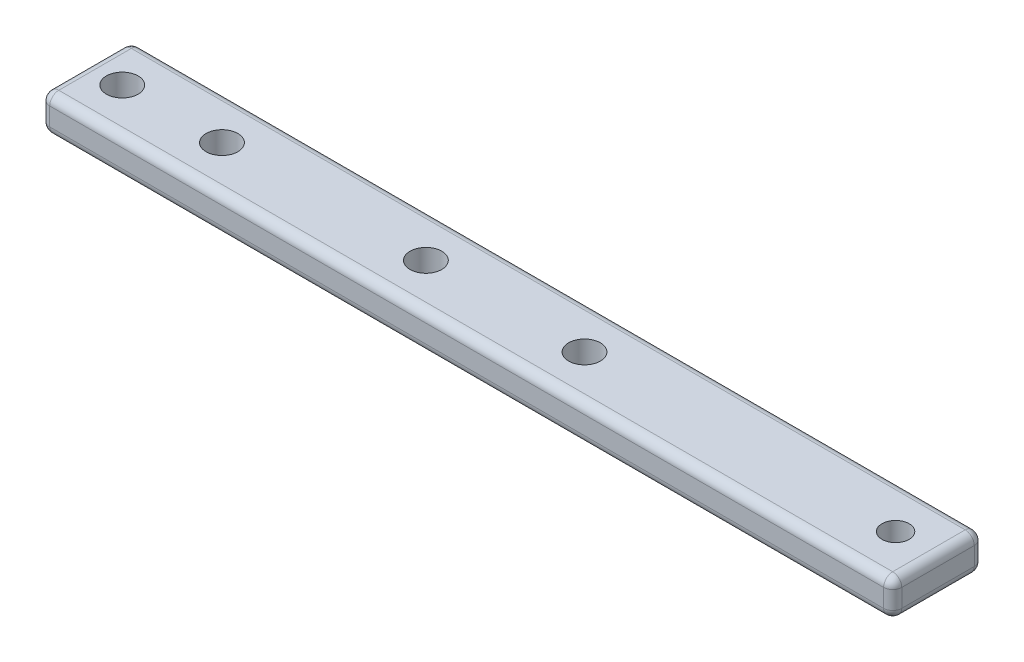
ISO-10303-21;
HEADER;
FILE_DESCRIPTION(('STEP AP214'),'2;1');
FILE_NAME('part.step','',(''),(''),'','','');
FILE_SCHEMA(('AUTOMOTIVE_DESIGN { 1 0 10303 214 1 1 1 1 }'));
ENDSEC;
DATA;
#1=APPLICATION_CONTEXT('core data for automotive mechanical design processes');
#2=APPLICATION_PROTOCOL_DEFINITION('international standard','automotive_design',2000,#1);
#3=PRODUCT_CONTEXT('',#1,'mechanical');
#4=PRODUCT('Part','Part','',(#3));
#5=PRODUCT_RELATED_PRODUCT_CATEGORY('part','',(#4));
#6=PRODUCT_DEFINITION_FORMATION('','',#4);
#7=PRODUCT_DEFINITION_CONTEXT('part definition',#1,'design');
#8=PRODUCT_DEFINITION('design','',#6,#7);
#9=PRODUCT_DEFINITION_SHAPE('','',#8);
#10=(LENGTH_UNIT() NAMED_UNIT(*) SI_UNIT(.MILLI.,.METRE.));
#11=(NAMED_UNIT(*) PLANE_ANGLE_UNIT() SI_UNIT($,.RADIAN.));
#12=(NAMED_UNIT(*) SI_UNIT($,.STERADIAN.) SOLID_ANGLE_UNIT());
#13=UNCERTAINTY_MEASURE_WITH_UNIT(LENGTH_MEASURE(1.E-05),#10,'distance_accuracy_value','');
#14=(GEOMETRIC_REPRESENTATION_CONTEXT(3) GLOBAL_UNCERTAINTY_ASSIGNED_CONTEXT((#13)) GLOBAL_UNIT_ASSIGNED_CONTEXT((#10,
#11,#12)) REPRESENTATION_CONTEXT('',''));
#15=CARTESIAN_POINT('',(0.,0.,0.));
#16=DIRECTION('',(0.,0.,1.));
#17=DIRECTION('',(1.,0.,0.));
#18=AXIS2_PLACEMENT_3D('',#15,#16,#17);
#19=CARTESIAN_POINT('',(-30.,4.,-5.));
#20=DIRECTION('',(0.,0.,1.));
#21=DIRECTION('',(1.,0.,0.));
#22=AXIS2_PLACEMENT_3D('',#19,#20,#21);
#23=PLANE('',#22);
#24=DIRECTION('',(-1.,0.,0.));
#25=VECTOR('',#24,1.);
#26=CARTESIAN_POINT('',(-30.,1.,-5.));
#27=LINE('',#26,#25);
#28=CARTESIAN_POINT('',(63.,1.,-5.));
#29=VERTEX_POINT('',#28);
#30=CARTESIAN_POINT('',(-29.,1.,-5.));
#31=VERTEX_POINT('',#30);
#32=EDGE_CURVE('E188',#29,#31,#27,.T.);
#33=ORIENTED_EDGE('',*,*,#32,.T.);
#34=DIRECTION('',(0.,-1.,0.));
#35=VECTOR('',#34,1.);
#36=CARTESIAN_POINT('',(-29.,4.,-5.));
#37=LINE('',#36,#35);
#38=CARTESIAN_POINT('',(-29.,3.,-5.));
#39=VERTEX_POINT('',#38);
#40=EDGE_CURVE('E190',#31,#39,#37,.F.);
#41=ORIENTED_EDGE('',*,*,#40,.T.);
#42=DIRECTION('',(-1.,0.,0.));
#43=VECTOR('',#42,1.);
#44=CARTESIAN_POINT('',(64.,3.,-5.));
#45=LINE('',#44,#43);
#46=CARTESIAN_POINT('',(63.,3.,-5.));
#47=VERTEX_POINT('',#46);
#48=EDGE_CURVE('E186',#39,#47,#45,.F.);
#49=ORIENTED_EDGE('',*,*,#48,.T.);
#50=DIRECTION('',(0.,-1.,0.));
#51=VECTOR('',#50,1.);
#52=CARTESIAN_POINT('',(63.,4.,-5.));
#53=LINE('',#52,#51);
#54=EDGE_CURVE('E184',#47,#29,#53,.T.);
#55=ORIENTED_EDGE('',*,*,#54,.T.);
#56=EDGE_LOOP('',(#33,#41,#49,#55));
#57=FACE_BOUND('',#56,.T.);
#58=ADVANCED_FACE('F39',(#57),#23,.F.);
#59=CARTESIAN_POINT('',(-30.,4.,-5.));
#60=DIRECTION('',(1.,0.,0.));
#61=DIRECTION('',(0.,0.,-1.));
#62=AXIS2_PLACEMENT_3D('',#59,#60,#61);
#63=PLANE('',#62);
#64=DIRECTION('',(0.,0.,1.));
#65=VECTOR('',#64,1.);
#66=CARTESIAN_POINT('',(-30.,3.,-5.));
#67=LINE('',#66,#65);
#68=CARTESIAN_POINT('',(-30.,3.,4.));
#69=VERTEX_POINT('',#68);
#70=CARTESIAN_POINT('',(-30.,3.,-4.));
#71=VERTEX_POINT('',#70);
#72=EDGE_CURVE('E135',#69,#71,#67,.F.);
#73=ORIENTED_EDGE('',*,*,#72,.T.);
#74=DIRECTION('',(0.,-1.,0.));
#75=VECTOR('',#74,1.);
#76=CARTESIAN_POINT('',(-30.,4.,-4.));
#77=LINE('',#76,#75);
#78=CARTESIAN_POINT('',(-30.,1.,-4.));
#79=VERTEX_POINT('',#78);
#80=EDGE_CURVE('E173',#71,#79,#77,.T.);
#81=ORIENTED_EDGE('',*,*,#80,.T.);
#82=DIRECTION('',(0.,0.,1.));
#83=VECTOR('',#82,1.);
#84=CARTESIAN_POINT('',(-30.,1.,-5.));
#85=LINE('',#84,#83);
#86=CARTESIAN_POINT('',(-30.,1.,4.));
#87=VERTEX_POINT('',#86);
#88=EDGE_CURVE('E166',#79,#87,#85,.T.);
#89=ORIENTED_EDGE('',*,*,#88,.T.);
#90=DIRECTION('',(0.,-1.,0.));
#91=VECTOR('',#90,1.);
#92=CARTESIAN_POINT('',(-30.,4.,4.));
#93=LINE('',#92,#91);
#94=EDGE_CURVE('E164',#87,#69,#93,.F.);
#95=ORIENTED_EDGE('',*,*,#94,.T.);
#96=EDGE_LOOP('',(#73,#81,#89,#95));
#97=FACE_BOUND('',#96,.T.);
#98=ADVANCED_FACE('F319',(#97),#63,.F.);
#99=CARTESIAN_POINT('',(-30.,4.,5.));
#100=DIRECTION('',(0.,0.,-1.));
#101=DIRECTION('',(-1.,0.,0.));
#102=AXIS2_PLACEMENT_3D('',#99,#100,#101);
#103=PLANE('',#102);
#104=DIRECTION('',(1.,0.,0.));
#105=VECTOR('',#104,1.);
#106=CARTESIAN_POINT('',(-30.,3.,5.));
#107=LINE('',#106,#105);
#108=CARTESIAN_POINT('',(63.,3.,5.));
#109=VERTEX_POINT('',#108);
#110=CARTESIAN_POINT('',(-29.,3.,5.));
#111=VERTEX_POINT('',#110);
#112=EDGE_CURVE('E48',#109,#111,#107,.F.);
#113=ORIENTED_EDGE('',*,*,#112,.T.);
#114=DIRECTION('',(0.,-1.,0.));
#115=VECTOR('',#114,1.);
#116=CARTESIAN_POINT('',(-29.,4.,5.));
#117=LINE('',#116,#115);
#118=CARTESIAN_POINT('',(-29.,1.,5.));
#119=VERTEX_POINT('',#118);
#120=EDGE_CURVE('E11',#111,#119,#117,.T.);
#121=ORIENTED_EDGE('',*,*,#120,.T.);
#122=DIRECTION('',(1.,0.,0.));
#123=VECTOR('',#122,1.);
#124=CARTESIAN_POINT('',(-30.,1.,5.));
#125=LINE('',#124,#123);
#126=CARTESIAN_POINT('',(63.,1.,5.));
#127=VERTEX_POINT('',#126);
#128=EDGE_CURVE('E202',#119,#127,#125,.T.);
#129=ORIENTED_EDGE('',*,*,#128,.T.);
#130=DIRECTION('',(0.,1.,0.));
#131=VECTOR('',#130,1.);
#132=CARTESIAN_POINT('',(63.,4.,5.));
#133=LINE('',#132,#131);
#134=EDGE_CURVE('E59',#127,#109,#133,.T.);
#135=ORIENTED_EDGE('',*,*,#134,.T.);
#136=EDGE_LOOP('',(#113,#121,#129,#135));
#137=FACE_BOUND('',#136,.T.);
#138=ADVANCED_FACE('F325',(#137),#103,.F.);
#139=CARTESIAN_POINT('',(0.,4.,0.));
#140=DIRECTION('',(0.,1.,0.));
#141=DIRECTION('',(0.,0.,1.));
#142=AXIS2_PLACEMENT_3D('',#139,#140,#141);
#143=PLANE('',#142);
#144=DIRECTION('',(-1.,0.,0.));
#145=VECTOR('',#144,1.);
#146=CARTESIAN_POINT('',(-30.,4.,-4.));
#147=LINE('',#146,#145);
#148=CARTESIAN_POINT('',(63.,4.,-4.));
#149=VERTEX_POINT('',#148);
#150=CARTESIAN_POINT('',(-29.,4.,-4.));
#151=VERTEX_POINT('',#150);
#152=EDGE_CURVE('E162',#149,#151,#147,.T.);
#153=ORIENTED_EDGE('',*,*,#152,.T.);
#154=DIRECTION('',(0.,0.,1.));
#155=VECTOR('',#154,1.);
#156=CARTESIAN_POINT('',(-29.,4.,5.));
#157=LINE('',#156,#155);
#158=CARTESIAN_POINT('',(-29.,4.,4.));
#159=VERTEX_POINT('',#158);
#160=EDGE_CURVE('E133',#151,#159,#157,.T.);
#161=ORIENTED_EDGE('',*,*,#160,.T.);
#162=DIRECTION('',(1.,0.,0.));
#163=VECTOR('',#162,1.);
#164=CARTESIAN_POINT('',(64.,4.,4.));
#165=LINE('',#164,#163);
#166=CARTESIAN_POINT('',(63.,4.,4.));
#167=VERTEX_POINT('',#166);
#168=EDGE_CURVE('E150',#159,#167,#165,.T.);
#169=ORIENTED_EDGE('',*,*,#168,.T.);
#170=DIRECTION('',(0.,0.,1.));
#171=VECTOR('',#170,1.);
#172=CARTESIAN_POINT('',(63.,4.,-5.));
#173=LINE('',#172,#171);
#174=EDGE_CURVE('E156',#167,#149,#173,.F.);
#175=ORIENTED_EDGE('',*,*,#174,.T.);
#176=EDGE_LOOP('',(#153,#161,#169,#175));
#177=FACE_BOUND('',#176,.T.);
#178=CARTESIAN_POINT('',(59.32,4.,0.));
#179=DIRECTION('',(0.,1.,0.));
#180=DIRECTION('',(0.,0.,1.));
#181=AXIS2_PLACEMENT_3D('',#178,#179,#180);
#182=CIRCLE('',#181,1.5);
#183=CARTESIAN_POINT('',(59.32,4.,1.5));
#184=VERTEX_POINT('',#183);
#185=EDGE_CURVE('E261',#184,#184,#182,.T.);
#186=ORIENTED_EDGE('',*,*,#185,.F.);
#187=EDGE_LOOP('',(#186));
#188=FACE_BOUND('',#187,.T.);
#189=CARTESIAN_POINT('',(-26.,4.,0.));
#190=DIRECTION('',(0.,1.,0.));
#191=DIRECTION('',(0.,0.,1.));
#192=AXIS2_PLACEMENT_3D('',#189,#190,#191);
#193=CIRCLE('',#192,1.75);
#194=CARTESIAN_POINT('',(-26.,4.,1.75));
#195=VERTEX_POINT('',#194);
#196=EDGE_CURVE('E277',#195,#195,#193,.T.);
#197=ORIENTED_EDGE('',*,*,#196,.F.);
#198=EDGE_LOOP('',(#197));
#199=FACE_BOUND('',#198,.T.);
#200=CARTESIAN_POINT('',(7.5,4.,0.));
#201=DIRECTION('',(0.,1.,0.));
#202=DIRECTION('',(0.,0.,1.));
#203=AXIS2_PLACEMENT_3D('',#200,#201,#202);
#204=CIRCLE('',#203,1.75);
#205=CARTESIAN_POINT('',(7.5,4.,1.75));
#206=VERTEX_POINT('',#205);
#207=EDGE_CURVE('E280',#206,#206,#204,.T.);
#208=ORIENTED_EDGE('',*,*,#207,.F.);
#209=EDGE_LOOP('',(#208));
#210=FACE_BOUND('',#209,.T.);
#211=CARTESIAN_POINT('',(25.,4.,0.));
#212=DIRECTION('',(0.,1.,0.));
#213=DIRECTION('',(0.,0.,1.));
#214=AXIS2_PLACEMENT_3D('',#211,#212,#213);
#215=CIRCLE('',#214,1.75);
#216=CARTESIAN_POINT('',(25.,4.,1.75));
#217=VERTEX_POINT('',#216);
#218=EDGE_CURVE('E286',#217,#217,#215,.T.);
#219=ORIENTED_EDGE('',*,*,#218,.F.);
#220=EDGE_LOOP('',(#219));
#221=FACE_BOUND('',#220,.T.);
#222=CARTESIAN_POINT('',(-15.,4.,0.));
#223=DIRECTION('',(0.,1.,0.));
#224=DIRECTION('',(0.,0.,1.));
#225=AXIS2_PLACEMENT_3D('',#222,#223,#224);
#226=CIRCLE('',#225,1.75);
#227=CARTESIAN_POINT('',(-15.,4.,1.75));
#228=VERTEX_POINT('',#227);
#229=EDGE_CURVE('E292',#228,#228,#226,.T.);
#230=ORIENTED_EDGE('',*,*,#229,.F.);
#231=EDGE_LOOP('',(#230));
#232=FACE_BOUND('',#231,.T.);
#233=ADVANCED_FACE('F159',(#177,#188,#199,#210,#221,#232),#143,.T.);
#234=CARTESIAN_POINT('',(0.,0.,0.));
#235=DIRECTION('',(0.,1.,0.));
#236=DIRECTION('',(0.,0.,1.));
#237=AXIS2_PLACEMENT_3D('',#234,#235,#236);
#238=PLANE('',#237);
#239=DIRECTION('',(1.,0.,0.));
#240=VECTOR('',#239,1.);
#241=CARTESIAN_POINT('',(0.,0.,4.));
#242=LINE('',#241,#240);
#243=CARTESIAN_POINT('',(63.,0.,4.));
#244=VERTEX_POINT('',#243);
#245=CARTESIAN_POINT('',(-29.,0.,4.));
#246=VERTEX_POINT('',#245);
#247=EDGE_CURVE('E175',#244,#246,#242,.F.);
#248=ORIENTED_EDGE('',*,*,#247,.T.);
#249=DIRECTION('',(0.,0.,1.));
#250=VECTOR('',#249,1.);
#251=CARTESIAN_POINT('',(-29.,0.,0.));
#252=LINE('',#251,#250);
#253=CARTESIAN_POINT('',(-29.,0.,-4.));
#254=VERTEX_POINT('',#253);
#255=EDGE_CURVE('E181',#246,#254,#252,.F.);
#256=ORIENTED_EDGE('',*,*,#255,.T.);
#257=DIRECTION('',(-1.,0.,0.));
#258=VECTOR('',#257,1.);
#259=CARTESIAN_POINT('',(0.,0.,-4.));
#260=LINE('',#259,#258);
#261=CARTESIAN_POINT('',(63.,0.,-4.));
#262=VERTEX_POINT('',#261);
#263=EDGE_CURVE('E179',#254,#262,#260,.F.);
#264=ORIENTED_EDGE('',*,*,#263,.T.);
#265=DIRECTION('',(0.,0.,1.));
#266=VECTOR('',#265,1.);
#267=CARTESIAN_POINT('',(63.,0.,0.));
#268=LINE('',#267,#266);
#269=EDGE_CURVE('E177',#262,#244,#268,.T.);
#270=ORIENTED_EDGE('',*,*,#269,.T.);
#271=EDGE_LOOP('',(#248,#256,#264,#270));
#272=FACE_BOUND('',#271,.T.);
#273=CARTESIAN_POINT('',(59.32,0.,0.));
#274=DIRECTION('',(0.,1.,0.));
#275=DIRECTION('',(0.,0.,1.));
#276=AXIS2_PLACEMENT_3D('',#273,#274,#275);
#277=CIRCLE('',#276,1.5);
#278=CARTESIAN_POINT('',(59.32,0.,1.5));
#279=VERTEX_POINT('',#278);
#280=EDGE_CURVE('E267',#279,#279,#277,.T.);
#281=ORIENTED_EDGE('',*,*,#280,.T.);
#282=EDGE_LOOP('',(#281));
#283=FACE_BOUND('',#282,.T.);
#284=CARTESIAN_POINT('',(-26.,0.,0.));
#285=DIRECTION('',(0.,1.,0.));
#286=DIRECTION('',(0.,0.,1.));
#287=AXIS2_PLACEMENT_3D('',#284,#285,#286);
#288=CIRCLE('',#287,1.75);
#289=CARTESIAN_POINT('',(-26.,0.,1.75));
#290=VERTEX_POINT('',#289);
#291=EDGE_CURVE('E157',#290,#290,#288,.T.);
#292=ORIENTED_EDGE('',*,*,#291,.T.);
#293=EDGE_LOOP('',(#292));
#294=FACE_BOUND('',#293,.T.);
#295=CARTESIAN_POINT('',(7.5,0.,0.));
#296=DIRECTION('',(0.,1.,0.));
#297=DIRECTION('',(0.,0.,1.));
#298=AXIS2_PLACEMENT_3D('',#295,#296,#297);
#299=CIRCLE('',#298,1.75);
#300=CARTESIAN_POINT('',(7.5,0.,1.75));
#301=VERTEX_POINT('',#300);
#302=EDGE_CURVE('E283',#301,#301,#299,.T.);
#303=ORIENTED_EDGE('',*,*,#302,.T.);
#304=EDGE_LOOP('',(#303));
#305=FACE_BOUND('',#304,.T.);
#306=CARTESIAN_POINT('',(25.,0.,0.));
#307=DIRECTION('',(0.,1.,0.));
#308=DIRECTION('',(0.,0.,1.));
#309=AXIS2_PLACEMENT_3D('',#306,#307,#308);
#310=CIRCLE('',#309,1.75);
#311=CARTESIAN_POINT('',(25.,0.,1.75));
#312=VERTEX_POINT('',#311);
#313=EDGE_CURVE('E289',#312,#312,#310,.T.);
#314=ORIENTED_EDGE('',*,*,#313,.T.);
#315=EDGE_LOOP('',(#314));
#316=FACE_BOUND('',#315,.T.);
#317=CARTESIAN_POINT('',(-15.,0.,0.));
#318=DIRECTION('',(0.,1.,0.));
#319=DIRECTION('',(0.,0.,1.));
#320=AXIS2_PLACEMENT_3D('',#317,#318,#319);
#321=CIRCLE('',#320,1.75);
#322=CARTESIAN_POINT('',(-15.,0.,1.75));
#323=VERTEX_POINT('',#322);
#324=EDGE_CURVE('E272',#323,#323,#321,.T.);
#325=ORIENTED_EDGE('',*,*,#324,.T.);
#326=EDGE_LOOP('',(#325));
#327=FACE_BOUND('',#326,.T.);
#328=ADVANCED_FACE('F555',(#272,#283,#294,#305,#316,#327),#238,.F.);
#329=CARTESIAN_POINT('',(-15.,0.,0.));
#330=DIRECTION('',(0.,1.,0.));
#331=DIRECTION('',(0.,0.,1.));
#332=AXIS2_PLACEMENT_3D('',#329,#330,#331);
#333=CYLINDRICAL_SURFACE('',#332,1.75);
#334=ORIENTED_EDGE('',*,*,#324,.F.);
#335=EDGE_LOOP('',(#334));
#336=FACE_BOUND('',#335,.T.);
#337=ORIENTED_EDGE('',*,*,#229,.T.);
#338=EDGE_LOOP('',(#337));
#339=FACE_BOUND('',#338,.T.);
#340=ADVANCED_FACE('F546',(#336,#339),#333,.F.);
#341=CARTESIAN_POINT('',(25.,0.,0.));
#342=DIRECTION('',(0.,1.,0.));
#343=DIRECTION('',(0.,0.,1.));
#344=AXIS2_PLACEMENT_3D('',#341,#342,#343);
#345=CYLINDRICAL_SURFACE('',#344,1.75);
#346=ORIENTED_EDGE('',*,*,#313,.F.);
#347=EDGE_LOOP('',(#346));
#348=FACE_BOUND('',#347,.T.);
#349=ORIENTED_EDGE('',*,*,#218,.T.);
#350=EDGE_LOOP('',(#349));
#351=FACE_BOUND('',#350,.T.);
#352=ADVANCED_FACE('F537',(#348,#351),#345,.F.);
#353=CARTESIAN_POINT('',(7.5,0.,0.));
#354=DIRECTION('',(0.,1.,0.));
#355=DIRECTION('',(0.,0.,1.));
#356=AXIS2_PLACEMENT_3D('',#353,#354,#355);
#357=CYLINDRICAL_SURFACE('',#356,1.75);
#358=ORIENTED_EDGE('',*,*,#302,.F.);
#359=EDGE_LOOP('',(#358));
#360=FACE_BOUND('',#359,.T.);
#361=ORIENTED_EDGE('',*,*,#207,.T.);
#362=EDGE_LOOP('',(#361));
#363=FACE_BOUND('',#362,.T.);
#364=ADVANCED_FACE('F528',(#360,#363),#357,.F.);
#365=CARTESIAN_POINT('',(-26.,0.,0.));
#366=DIRECTION('',(0.,1.,0.));
#367=DIRECTION('',(0.,0.,1.));
#368=AXIS2_PLACEMENT_3D('',#365,#366,#367);
#369=CYLINDRICAL_SURFACE('',#368,1.75);
#370=ORIENTED_EDGE('',*,*,#291,.F.);
#371=EDGE_LOOP('',(#370));
#372=FACE_BOUND('',#371,.T.);
#373=ORIENTED_EDGE('',*,*,#196,.T.);
#374=EDGE_LOOP('',(#373));
#375=FACE_BOUND('',#374,.T.);
#376=ADVANCED_FACE('F519',(#372,#375),#369,.F.);
#377=CARTESIAN_POINT('',(59.32,-6.,0.));
#378=DIRECTION('',(0.,1.,0.));
#379=DIRECTION('',(0.,0.,1.));
#380=AXIS2_PLACEMENT_3D('',#377,#378,#379);
#381=CYLINDRICAL_SURFACE('',#380,1.5);
#382=ORIENTED_EDGE('',*,*,#185,.T.);
#383=EDGE_LOOP('',(#382));
#384=FACE_BOUND('',#383,.T.);
#385=ORIENTED_EDGE('',*,*,#280,.F.);
#386=EDGE_LOOP('',(#385));
#387=FACE_BOUND('',#386,.T.);
#388=ADVANCED_FACE('F511',(#384,#387),#381,.F.);
#389=CARTESIAN_POINT('',(64.,4.,-5.));
#390=DIRECTION('',(-1.,0.,0.));
#391=DIRECTION('',(0.,0.,1.));
#392=AXIS2_PLACEMENT_3D('',#389,#390,#391);
#393=PLANE('',#392);
#394=DIRECTION('',(0.,-1.,0.));
#395=VECTOR('',#394,1.);
#396=CARTESIAN_POINT('',(64.,4.,-4.));
#397=LINE('',#396,#395);
#398=CARTESIAN_POINT('',(64.,1.,-4.));
#399=VERTEX_POINT('',#398);
#400=CARTESIAN_POINT('',(64.,3.,-4.));
#401=VERTEX_POINT('',#400);
#402=EDGE_CURVE('E197',#399,#401,#397,.F.);
#403=ORIENTED_EDGE('',*,*,#402,.T.);
#404=DIRECTION('',(0.,0.,1.));
#405=VECTOR('',#404,1.);
#406=CARTESIAN_POINT('',(64.,3.,5.));
#407=LINE('',#406,#405);
#408=CARTESIAN_POINT('',(64.,3.,4.));
#409=VERTEX_POINT('',#408);
#410=EDGE_CURVE('E199',#401,#409,#407,.T.);
#411=ORIENTED_EDGE('',*,*,#410,.T.);
#412=DIRECTION('',(0.,1.,0.));
#413=VECTOR('',#412,1.);
#414=CARTESIAN_POINT('',(64.,4.,4.));
#415=LINE('',#414,#413);
#416=CARTESIAN_POINT('',(64.,1.,4.));
#417=VERTEX_POINT('',#416);
#418=EDGE_CURVE('E193',#409,#417,#415,.F.);
#419=ORIENTED_EDGE('',*,*,#418,.T.);
#420=DIRECTION('',(0.,0.,1.));
#421=VECTOR('',#420,1.);
#422=CARTESIAN_POINT('',(64.,1.,-5.));
#423=LINE('',#422,#421);
#424=EDGE_CURVE('E195',#417,#399,#423,.F.);
#425=ORIENTED_EDGE('',*,*,#424,.T.);
#426=EDGE_LOOP('',(#403,#411,#419,#425));
#427=FACE_BOUND('',#426,.T.);
#428=ADVANCED_FACE('F503',(#427),#393,.F.);
#429=CARTESIAN_POINT('',(63.,1.,0.));
#430=DIRECTION('',(0.,0.,1.));
#431=DIRECTION('',(1.,0.,0.));
#432=AXIS2_PLACEMENT_3D('',#429,#430,#431);
#433=CYLINDRICAL_SURFACE('',#432,1.);
#434=CARTESIAN_POINT('',(63.,1.,-4.));
#435=DIRECTION('',(0.,0.,-1.));
#436=DIRECTION('',(-1.,0.,0.));
#437=AXIS2_PLACEMENT_3D('',#434,#435,#436);
#438=CIRCLE('',#437,1.);
#439=EDGE_CURVE('E43',#399,#262,#438,.T.);
#440=ORIENTED_EDGE('',*,*,#439,.F.);
#441=ORIENTED_EDGE('',*,*,#424,.F.);
#442=CARTESIAN_POINT('',(63.,1.,4.));
#443=DIRECTION('',(0.,0.,1.));
#444=DIRECTION('',(1.,0.,0.));
#445=AXIS2_PLACEMENT_3D('',#442,#443,#444);
#446=CIRCLE('',#445,1.);
#447=EDGE_CURVE('E254',#244,#417,#446,.T.);
#448=ORIENTED_EDGE('',*,*,#447,.F.);
#449=ORIENTED_EDGE('',*,*,#269,.F.);
#450=EDGE_LOOP('',(#440,#441,#448,#449));
#451=FACE_BOUND('',#450,.T.);
#452=ADVANCED_FACE('F41',(#451),#433,.T.);
#453=CARTESIAN_POINT('',(63.,1.,-4.));
#454=DIRECTION('',(0.,-1.,0.));
#455=DIRECTION('',(0.,0.,-1.));
#456=AXIS2_PLACEMENT_3D('',#453,#454,#455);
#457=SPHERICAL_SURFACE('',#456,1.);
#458=CARTESIAN_POINT('',(63.,1.,-4.));
#459=DIRECTION('',(0.,-1.,0.));
#460=DIRECTION('',(0.,0.,-1.));
#461=AXIS2_PLACEMENT_3D('',#458,#459,#460);
#462=CIRCLE('',#461,1.);
#463=EDGE_CURVE('E249',#399,#29,#462,.F.);
#464=ORIENTED_EDGE('',*,*,#463,.F.);
#465=ORIENTED_EDGE('',*,*,#439,.T.);
#466=CARTESIAN_POINT('',(63.,1.,-4.));
#467=DIRECTION('',(1.,0.,0.));
#468=DIRECTION('',(0.,0.,-1.));
#469=AXIS2_PLACEMENT_3D('',#466,#467,#468);
#470=CIRCLE('',#469,1.);
#471=EDGE_CURVE('E252',#29,#262,#470,.F.);
#472=ORIENTED_EDGE('',*,*,#471,.F.);
#473=EDGE_LOOP('',(#464,#465,#472));
#474=FACE_BOUND('',#473,.T.);
#475=ADVANCED_FACE('F489',(#474),#457,.T.);
#476=CARTESIAN_POINT('',(63.,1.,4.));
#477=DIRECTION('',(1.,0.,0.));
#478=DIRECTION('',(0.,0.,-1.));
#479=AXIS2_PLACEMENT_3D('',#476,#477,#478);
#480=SPHERICAL_SURFACE('',#479,1.);
#481=CARTESIAN_POINT('',(63.,1.,4.));
#482=DIRECTION('',(1.,0.,0.));
#483=DIRECTION('',(0.,0.,-1.));
#484=AXIS2_PLACEMENT_3D('',#481,#482,#483);
#485=CIRCLE('',#484,1.);
#486=EDGE_CURVE('E243',#244,#127,#485,.F.);
#487=ORIENTED_EDGE('',*,*,#486,.F.);
#488=ORIENTED_EDGE('',*,*,#447,.T.);
#489=CARTESIAN_POINT('',(63.,1.,4.));
#490=DIRECTION('',(0.,-1.,0.));
#491=DIRECTION('',(0.,0.,-1.));
#492=AXIS2_PLACEMENT_3D('',#489,#490,#491);
#493=CIRCLE('',#492,1.);
#494=EDGE_CURVE('E246',#127,#417,#493,.F.);
#495=ORIENTED_EDGE('',*,*,#494,.F.);
#496=EDGE_LOOP('',(#487,#488,#495));
#497=FACE_BOUND('',#496,.T.);
#498=ADVANCED_FACE('F331',(#497),#480,.T.);
#499=CARTESIAN_POINT('',(-30.,1.,-4.));
#500=DIRECTION('',(-1.,0.,0.));
#501=DIRECTION('',(0.,0.,1.));
#502=AXIS2_PLACEMENT_3D('',#499,#500,#501);
#503=CYLINDRICAL_SURFACE('',#502,1.);
#504=ORIENTED_EDGE('',*,*,#471,.T.);
#505=ORIENTED_EDGE('',*,*,#263,.F.);
#506=CARTESIAN_POINT('',(-29.,1.,-4.));
#507=DIRECTION('',(-1.,0.,0.));
#508=DIRECTION('',(0.,0.,1.));
#509=AXIS2_PLACEMENT_3D('',#506,#507,#508);
#510=CIRCLE('',#509,1.);
#511=EDGE_CURVE('E238',#31,#254,#510,.T.);
#512=ORIENTED_EDGE('',*,*,#511,.F.);
#513=ORIENTED_EDGE('',*,*,#32,.F.);
#514=EDGE_LOOP('',(#504,#505,#512,#513));
#515=FACE_BOUND('',#514,.T.);
#516=ADVANCED_FACE('F472',(#515),#503,.T.);
#517=CARTESIAN_POINT('',(63.,4.,-4.));
#518=DIRECTION('',(0.,-1.,0.));
#519=DIRECTION('',(0.,0.,-1.));
#520=AXIS2_PLACEMENT_3D('',#517,#518,#519);
#521=CYLINDRICAL_SURFACE('',#520,1.);
#522=ORIENTED_EDGE('',*,*,#463,.T.);
#523=ORIENTED_EDGE('',*,*,#54,.F.);
#524=CARTESIAN_POINT('',(63.,3.,-4.));
#525=DIRECTION('',(0.,1.,0.));
#526=DIRECTION('',(0.,0.,1.));
#527=AXIS2_PLACEMENT_3D('',#524,#525,#526);
#528=CIRCLE('',#527,1.);
#529=EDGE_CURVE('E235',#401,#47,#528,.T.);
#530=ORIENTED_EDGE('',*,*,#529,.F.);
#531=ORIENTED_EDGE('',*,*,#402,.F.);
#532=EDGE_LOOP('',(#522,#523,#530,#531));
#533=FACE_BOUND('',#532,.T.);
#534=ADVANCED_FACE('F464',(#533),#521,.T.);
#535=CARTESIAN_POINT('',(63.,3.,-5.));
#536=DIRECTION('',(0.,0.,-1.));
#537=DIRECTION('',(-1.,0.,0.));
#538=AXIS2_PLACEMENT_3D('',#535,#536,#537);
#539=CYLINDRICAL_SURFACE('',#538,1.);
#540=CARTESIAN_POINT('',(63.,3.,4.));
#541=DIRECTION('',(0.,0.,1.));
#542=DIRECTION('',(1.,0.,0.));
#543=AXIS2_PLACEMENT_3D('',#540,#541,#542);
#544=CIRCLE('',#543,1.);
#545=EDGE_CURVE('E229',#409,#167,#544,.T.);
#546=ORIENTED_EDGE('',*,*,#545,.F.);
#547=ORIENTED_EDGE('',*,*,#410,.F.);
#548=CARTESIAN_POINT('',(63.,3.,-4.));
#549=DIRECTION('',(0.,0.,-1.));
#550=DIRECTION('',(-1.,0.,0.));
#551=AXIS2_PLACEMENT_3D('',#548,#549,#550);
#552=CIRCLE('',#551,1.);
#553=EDGE_CURVE('E232',#149,#401,#552,.T.);
#554=ORIENTED_EDGE('',*,*,#553,.F.);
#555=ORIENTED_EDGE('',*,*,#174,.F.);
#556=EDGE_LOOP('',(#546,#547,#554,#555));
#557=FACE_BOUND('',#556,.T.);
#558=ADVANCED_FACE('F301',(#557),#539,.T.);
#559=CARTESIAN_POINT('',(63.,4.,4.));
#560=DIRECTION('',(0.,1.,0.));
#561=DIRECTION('',(0.,0.,1.));
#562=AXIS2_PLACEMENT_3D('',#559,#560,#561);
#563=CYLINDRICAL_SURFACE('',#562,1.);
#564=ORIENTED_EDGE('',*,*,#494,.T.);
#565=ORIENTED_EDGE('',*,*,#418,.F.);
#566=CARTESIAN_POINT('',(63.,3.,4.));
#567=DIRECTION('',(0.,1.,0.));
#568=DIRECTION('',(0.,0.,1.));
#569=AXIS2_PLACEMENT_3D('',#566,#567,#568);
#570=CIRCLE('',#569,1.);
#571=EDGE_CURVE('E227',#109,#409,#570,.T.);
#572=ORIENTED_EDGE('',*,*,#571,.F.);
#573=ORIENTED_EDGE('',*,*,#134,.F.);
#574=EDGE_LOOP('',(#564,#565,#572,#573));
#575=FACE_BOUND('',#574,.T.);
#576=ADVANCED_FACE('F334',(#575),#563,.T.);
#577=CARTESIAN_POINT('',(-30.,1.,4.));
#578=DIRECTION('',(1.,0.,0.));
#579=DIRECTION('',(0.,0.,-1.));
#580=AXIS2_PLACEMENT_3D('',#577,#578,#579);
#581=CYLINDRICAL_SURFACE('',#580,1.);
#582=ORIENTED_EDGE('',*,*,#486,.T.);
#583=ORIENTED_EDGE('',*,*,#128,.F.);
#584=CARTESIAN_POINT('',(-29.,1.,4.));
#585=DIRECTION('',(-1.,0.,0.));
#586=DIRECTION('',(0.,0.,1.));
#587=AXIS2_PLACEMENT_3D('',#584,#585,#586);
#588=CIRCLE('',#587,1.);
#589=EDGE_CURVE('E224',#246,#119,#588,.T.);
#590=ORIENTED_EDGE('',*,*,#589,.F.);
#591=ORIENTED_EDGE('',*,*,#247,.F.);
#592=EDGE_LOOP('',(#582,#583,#590,#591));
#593=FACE_BOUND('',#592,.T.);
#594=ADVANCED_FACE('F330',(#593),#581,.T.);
#595=CARTESIAN_POINT('',(-29.,1.,-5.));
#596=DIRECTION('',(0.,0.,1.));
#597=DIRECTION('',(1.,0.,0.));
#598=AXIS2_PLACEMENT_3D('',#595,#596,#597);
#599=CYLINDRICAL_SURFACE('',#598,1.);
#600=CARTESIAN_POINT('',(-29.,1.,-4.));
#601=DIRECTION('',(0.,0.,-1.));
#602=DIRECTION('',(-1.,0.,0.));
#603=AXIS2_PLACEMENT_3D('',#600,#601,#602);
#604=CIRCLE('',#603,1.);
#605=EDGE_CURVE('E240',#254,#79,#604,.T.);
#606=ORIENTED_EDGE('',*,*,#605,.F.);
#607=ORIENTED_EDGE('',*,*,#255,.F.);
#608=CARTESIAN_POINT('',(-29.,1.,4.));
#609=DIRECTION('',(0.,0.,1.));
#610=DIRECTION('',(1.,0.,0.));
#611=AXIS2_PLACEMENT_3D('',#608,#609,#610);
#612=CIRCLE('',#611,1.);
#613=EDGE_CURVE('E221',#87,#246,#612,.T.);
#614=ORIENTED_EDGE('',*,*,#613,.F.);
#615=ORIENTED_EDGE('',*,*,#88,.F.);
#616=EDGE_LOOP('',(#606,#607,#614,#615));
#617=FACE_BOUND('',#616,.T.);
#618=ADVANCED_FACE('F433',(#617),#599,.T.);
#619=CARTESIAN_POINT('',(-29.,1.,-4.));
#620=DIRECTION('',(0.,-1.,0.));
#621=DIRECTION('',(0.,0.,-1.));
#622=AXIS2_PLACEMENT_3D('',#619,#620,#621);
#623=SPHERICAL_SURFACE('',#622,1.);
#624=ORIENTED_EDGE('',*,*,#511,.T.);
#625=ORIENTED_EDGE('',*,*,#605,.T.);
#626=CARTESIAN_POINT('',(-29.,1.,-4.));
#627=DIRECTION('',(0.,-1.,0.));
#628=DIRECTION('',(0.,0.,-1.));
#629=AXIS2_PLACEMENT_3D('',#626,#627,#628);
#630=CIRCLE('',#629,1.);
#631=EDGE_CURVE('E218',#31,#79,#630,.F.);
#632=ORIENTED_EDGE('',*,*,#631,.F.);
#633=EDGE_LOOP('',(#624,#625,#632));
#634=FACE_BOUND('',#633,.T.);
#635=ADVANCED_FACE('F346',(#634),#623,.T.);
#636=CARTESIAN_POINT('',(63.,3.,-4.));
#637=DIRECTION('',(1.,0.,0.));
#638=DIRECTION('',(0.,0.,-1.));
#639=AXIS2_PLACEMENT_3D('',#636,#637,#638);
#640=SPHERICAL_SURFACE('',#639,1.);
#641=ORIENTED_EDGE('',*,*,#553,.T.);
#642=ORIENTED_EDGE('',*,*,#529,.T.);
#643=CARTESIAN_POINT('',(63.,3.,-4.));
#644=DIRECTION('',(1.,0.,0.));
#645=DIRECTION('',(0.,0.,-1.));
#646=AXIS2_PLACEMENT_3D('',#643,#644,#645);
#647=CIRCLE('',#646,1.);
#648=EDGE_CURVE('E215',#149,#47,#647,.F.);
#649=ORIENTED_EDGE('',*,*,#648,.F.);
#650=EDGE_LOOP('',(#641,#642,#649));
#651=FACE_BOUND('',#650,.T.);
#652=ADVANCED_FACE('F304',(#651),#640,.T.);
#653=CARTESIAN_POINT('',(63.,3.,4.));
#654=DIRECTION('',(1.,0.,0.));
#655=DIRECTION('',(0.,0.,-1.));
#656=AXIS2_PLACEMENT_3D('',#653,#654,#655);
#657=SPHERICAL_SURFACE('',#656,1.);
#658=ORIENTED_EDGE('',*,*,#571,.T.);
#659=ORIENTED_EDGE('',*,*,#545,.T.);
#660=CARTESIAN_POINT('',(63.,3.,4.));
#661=DIRECTION('',(1.,0.,0.));
#662=DIRECTION('',(0.,0.,-1.));
#663=AXIS2_PLACEMENT_3D('',#660,#661,#662);
#664=CIRCLE('',#663,1.);
#665=EDGE_CURVE('E153',#109,#167,#664,.F.);
#666=ORIENTED_EDGE('',*,*,#665,.F.);
#667=EDGE_LOOP('',(#658,#659,#666));
#668=FACE_BOUND('',#667,.T.);
#669=ADVANCED_FACE('F336',(#668),#657,.T.);
#670=CARTESIAN_POINT('',(-29.,1.,4.));
#671=DIRECTION('',(0.,-1.,0.));
#672=DIRECTION('',(0.,0.,-1.));
#673=AXIS2_PLACEMENT_3D('',#670,#671,#672);
#674=SPHERICAL_SURFACE('',#673,1.);
#675=ORIENTED_EDGE('',*,*,#613,.T.);
#676=ORIENTED_EDGE('',*,*,#589,.T.);
#677=CARTESIAN_POINT('',(-29.,1.,4.));
#678=DIRECTION('',(0.,-1.,0.));
#679=DIRECTION('',(0.,0.,-1.));
#680=AXIS2_PLACEMENT_3D('',#677,#678,#679);
#681=CIRCLE('',#680,1.);
#682=EDGE_CURVE('E212',#87,#119,#681,.F.);
#683=ORIENTED_EDGE('',*,*,#682,.F.);
#684=EDGE_LOOP('',(#675,#676,#683));
#685=FACE_BOUND('',#684,.T.);
#686=ADVANCED_FACE('F338',(#685),#674,.T.);
#687=CARTESIAN_POINT('',(-29.,4.,-4.));
#688=DIRECTION('',(0.,-1.,0.));
#689=DIRECTION('',(0.,0.,-1.));
#690=AXIS2_PLACEMENT_3D('',#687,#688,#689);
#691=CYLINDRICAL_SURFACE('',#690,1.);
#692=ORIENTED_EDGE('',*,*,#631,.T.);
#693=ORIENTED_EDGE('',*,*,#80,.F.);
#694=CARTESIAN_POINT('',(-29.,3.,-4.));
#695=DIRECTION('',(0.,1.,0.));
#696=DIRECTION('',(0.,0.,1.));
#697=AXIS2_PLACEMENT_3D('',#694,#695,#696);
#698=CIRCLE('',#697,1.);
#699=EDGE_CURVE('E209',#39,#71,#698,.T.);
#700=ORIENTED_EDGE('',*,*,#699,.F.);
#701=ORIENTED_EDGE('',*,*,#40,.F.);
#702=EDGE_LOOP('',(#692,#693,#700,#701));
#703=FACE_BOUND('',#702,.T.);
#704=ADVANCED_FACE('F315',(#703),#691,.T.);
#705=CARTESIAN_POINT('',(0.,3.,-4.));
#706=DIRECTION('',(1.,0.,0.));
#707=DIRECTION('',(0.,0.,-1.));
#708=AXIS2_PLACEMENT_3D('',#705,#706,#707);
#709=CYLINDRICAL_SURFACE('',#708,1.);
#710=ORIENTED_EDGE('',*,*,#648,.T.);
#711=ORIENTED_EDGE('',*,*,#48,.F.);
#712=CARTESIAN_POINT('',(-29.,3.,-4.));
#713=DIRECTION('',(-1.,0.,0.));
#714=DIRECTION('',(0.,0.,1.));
#715=AXIS2_PLACEMENT_3D('',#712,#713,#714);
#716=CIRCLE('',#715,1.);
#717=EDGE_CURVE('E147',#151,#39,#716,.T.);
#718=ORIENTED_EDGE('',*,*,#717,.F.);
#719=ORIENTED_EDGE('',*,*,#152,.F.);
#720=EDGE_LOOP('',(#710,#711,#718,#719));
#721=FACE_BOUND('',#720,.T.);
#722=ADVANCED_FACE('F307',(#721),#709,.T.);
#723=CARTESIAN_POINT('',(0.,3.,4.));
#724=DIRECTION('',(-1.,0.,0.));
#725=DIRECTION('',(0.,0.,1.));
#726=AXIS2_PLACEMENT_3D('',#723,#724,#725);
#727=CYLINDRICAL_SURFACE('',#726,1.);
#728=ORIENTED_EDGE('',*,*,#665,.T.);
#729=ORIENTED_EDGE('',*,*,#168,.F.);
#730=CARTESIAN_POINT('',(-29.,3.,4.));
#731=DIRECTION('',(-1.,0.,0.));
#732=DIRECTION('',(0.,0.,1.));
#733=AXIS2_PLACEMENT_3D('',#730,#731,#732);
#734=CIRCLE('',#733,1.);
#735=EDGE_CURVE('E141',#111,#159,#734,.T.);
#736=ORIENTED_EDGE('',*,*,#735,.F.);
#737=ORIENTED_EDGE('',*,*,#112,.F.);
#738=EDGE_LOOP('',(#728,#729,#736,#737));
#739=FACE_BOUND('',#738,.T.);
#740=ADVANCED_FACE('F151',(#739),#727,.T.);
#741=CARTESIAN_POINT('',(-29.,4.,4.));
#742=DIRECTION('',(0.,-1.,0.));
#743=DIRECTION('',(0.,0.,-1.));
#744=AXIS2_PLACEMENT_3D('',#741,#742,#743);
#745=CYLINDRICAL_SURFACE('',#744,1.);
#746=ORIENTED_EDGE('',*,*,#682,.T.);
#747=ORIENTED_EDGE('',*,*,#120,.F.);
#748=CARTESIAN_POINT('',(-29.,3.,4.));
#749=DIRECTION('',(0.,1.,0.));
#750=DIRECTION('',(0.,0.,1.));
#751=AXIS2_PLACEMENT_3D('',#748,#749,#750);
#752=CIRCLE('',#751,1.);
#753=EDGE_CURVE('E145',#69,#111,#752,.T.);
#754=ORIENTED_EDGE('',*,*,#753,.F.);
#755=ORIENTED_EDGE('',*,*,#94,.F.);
#756=EDGE_LOOP('',(#746,#747,#754,#755));
#757=FACE_BOUND('',#756,.T.);
#758=ADVANCED_FACE('F323',(#757),#745,.T.);
#759=CARTESIAN_POINT('',(-29.,3.,-4.));
#760=DIRECTION('',(0.,0.,-1.));
#761=DIRECTION('',(-1.,0.,0.));
#762=AXIS2_PLACEMENT_3D('',#759,#760,#761);
#763=SPHERICAL_SURFACE('',#762,1.);
#764=ORIENTED_EDGE('',*,*,#717,.T.);
#765=ORIENTED_EDGE('',*,*,#699,.T.);
#766=CARTESIAN_POINT('',(-29.,3.,-4.));
#767=DIRECTION('',(0.,0.,-1.));
#768=DIRECTION('',(-1.,0.,0.));
#769=AXIS2_PLACEMENT_3D('',#766,#767,#768);
#770=CIRCLE('',#769,1.);
#771=EDGE_CURVE('E138',#151,#71,#770,.F.);
#772=ORIENTED_EDGE('',*,*,#771,.F.);
#773=EDGE_LOOP('',(#764,#765,#772));
#774=FACE_BOUND('',#773,.T.);
#775=ADVANCED_FACE('F311',(#774),#763,.T.);
#776=CARTESIAN_POINT('',(-29.,3.,4.));
#777=DIRECTION('',(0.,0.,1.));
#778=DIRECTION('',(1.,0.,0.));
#779=AXIS2_PLACEMENT_3D('',#776,#777,#778);
#780=SPHERICAL_SURFACE('',#779,1.);
#781=ORIENTED_EDGE('',*,*,#753,.T.);
#782=ORIENTED_EDGE('',*,*,#735,.T.);
#783=CARTESIAN_POINT('',(-29.,3.,4.));
#784=DIRECTION('',(0.,0.,1.));
#785=DIRECTION('',(1.,0.,0.));
#786=AXIS2_PLACEMENT_3D('',#783,#784,#785);
#787=CIRCLE('',#786,1.);
#788=EDGE_CURVE('E129',#69,#159,#787,.F.);
#789=ORIENTED_EDGE('',*,*,#788,.F.);
#790=EDGE_LOOP('',(#781,#782,#789));
#791=FACE_BOUND('',#790,.T.);
#792=ADVANCED_FACE('F143',(#791),#780,.T.);
#793=CARTESIAN_POINT('',(-29.,3.,0.));
#794=DIRECTION('',(0.,0.,-1.));
#795=DIRECTION('',(-1.,0.,0.));
#796=AXIS2_PLACEMENT_3D('',#793,#794,#795);
#797=CYLINDRICAL_SURFACE('',#796,1.);
#798=ORIENTED_EDGE('',*,*,#771,.T.);
#799=ORIENTED_EDGE('',*,*,#72,.F.);
#800=ORIENTED_EDGE('',*,*,#788,.T.);
#801=ORIENTED_EDGE('',*,*,#160,.F.);
#802=EDGE_LOOP('',(#798,#799,#800,#801));
#803=FACE_BOUND('',#802,.T.);
#804=ADVANCED_FACE('F131',(#803),#797,.T.);
#805=CLOSED_SHELL('',(#58,#98,#138,#233,#328,#340,#352,#364,#376,#388,#428,#452,#475,#498,#516,
#534,#558,#576,#594,#618,#635,#652,#669,#686,#704,#722,#740,#758,#775,#792,#804));
#806=MANIFOLD_SOLID_BREP('B2',#805);
#807=ADVANCED_BREP_SHAPE_REPRESENTATION('',(#18,#806),#14);
#808=SHAPE_DEFINITION_REPRESENTATION(#9,#807);
ENDSEC;
END-ISO-10303-21;
